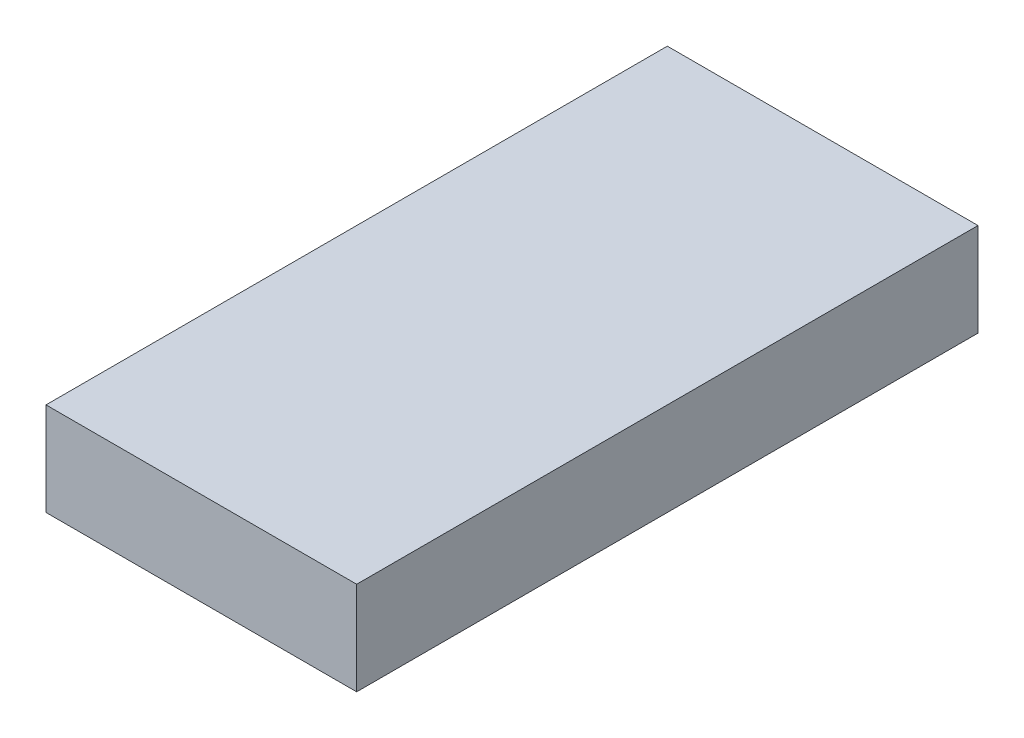
ISO-10303-21;
HEADER;
FILE_DESCRIPTION(('STEP AP214'),'2;1');
FILE_NAME('part.step','',(''),(''),'','','');
FILE_SCHEMA(('AUTOMOTIVE_DESIGN { 1 0 10303 214 1 1 1 1 }'));
ENDSEC;
DATA;
#1=APPLICATION_CONTEXT('core data for automotive mechanical design processes');
#2=APPLICATION_PROTOCOL_DEFINITION('international standard','automotive_design',2000,#1);
#3=PRODUCT_CONTEXT('',#1,'mechanical');
#4=PRODUCT('Part','Part','',(#3));
#5=PRODUCT_RELATED_PRODUCT_CATEGORY('part','',(#4));
#6=PRODUCT_DEFINITION_FORMATION('','',#4);
#7=PRODUCT_DEFINITION_CONTEXT('part definition',#1,'design');
#8=PRODUCT_DEFINITION('design','',#6,#7);
#9=PRODUCT_DEFINITION_SHAPE('','',#8);
#10=(LENGTH_UNIT() NAMED_UNIT(*) SI_UNIT(.MILLI.,.METRE.));
#11=(NAMED_UNIT(*) PLANE_ANGLE_UNIT() SI_UNIT($,.RADIAN.));
#12=(NAMED_UNIT(*) SI_UNIT($,.STERADIAN.) SOLID_ANGLE_UNIT());
#13=UNCERTAINTY_MEASURE_WITH_UNIT(LENGTH_MEASURE(1.E-05),#10,'distance_accuracy_value','');
#14=(GEOMETRIC_REPRESENTATION_CONTEXT(3) GLOBAL_UNCERTAINTY_ASSIGNED_CONTEXT((#13)) GLOBAL_UNIT_ASSIGNED_CONTEXT((#10,
#11,#12)) REPRESENTATION_CONTEXT('',''));
#15=CARTESIAN_POINT('',(0.,0.,0.));
#16=DIRECTION('',(0.,0.,1.));
#17=DIRECTION('',(1.,0.,0.));
#18=AXIS2_PLACEMENT_3D('',#15,#16,#17);
#19=CARTESIAN_POINT('',(0.,1.5,0.));
#20=DIRECTION('',(-1.,0.,0.));
#21=DIRECTION('',(0.,0.,1.));
#22=AXIS2_PLACEMENT_3D('',#19,#20,#21);
#23=PLANE('',#22);
#24=DIRECTION('',(0.,0.,-1.));
#25=VECTOR('',#24,1.);
#26=CARTESIAN_POINT('',(0.,0.,0.));
#27=LINE('',#26,#25);
#28=CARTESIAN_POINT('',(0.,0.,0.));
#29=VERTEX_POINT('',#28);
#30=CARTESIAN_POINT('',(0.,0.,-10.));
#31=VERTEX_POINT('',#30);
#32=EDGE_CURVE('E111',#29,#31,#27,.T.);
#33=ORIENTED_EDGE('',*,*,#32,.T.);
#34=DIRECTION('',(0.,-1.,0.));
#35=VECTOR('',#34,1.);
#36=CARTESIAN_POINT('',(0.,1.5,-10.));
#37=LINE('',#36,#35);
#38=CARTESIAN_POINT('',(0.,1.5,-10.));
#39=VERTEX_POINT('',#38);
#40=EDGE_CURVE('E11',#39,#31,#37,.T.);
#41=ORIENTED_EDGE('',*,*,#40,.F.);
#42=DIRECTION('',(0.,0.,-1.));
#43=VECTOR('',#42,1.);
#44=CARTESIAN_POINT('',(0.,1.5,0.));
#45=LINE('',#44,#43);
#46=CARTESIAN_POINT('',(0.,1.5,0.));
#47=VERTEX_POINT('',#46);
#48=EDGE_CURVE('E95',#47,#39,#45,.T.);
#49=ORIENTED_EDGE('',*,*,#48,.F.);
#50=DIRECTION('',(0.,-1.,0.));
#51=VECTOR('',#50,1.);
#52=CARTESIAN_POINT('',(0.,1.5,0.));
#53=LINE('',#52,#51);
#54=EDGE_CURVE('E107',#47,#29,#53,.T.);
#55=ORIENTED_EDGE('',*,*,#54,.T.);
#56=EDGE_LOOP('',(#33,#41,#49,#55));
#57=FACE_BOUND('',#56,.T.);
#58=ADVANCED_FACE('F43',(#57),#23,.F.);
#59=CARTESIAN_POINT('',(0.,1.5,-10.));
#60=DIRECTION('',(0.,0.,1.));
#61=DIRECTION('',(1.,0.,0.));
#62=AXIS2_PLACEMENT_3D('',#59,#60,#61);
#63=PLANE('',#62);
#64=DIRECTION('',(-1.,0.,0.));
#65=VECTOR('',#64,1.);
#66=CARTESIAN_POINT('',(0.,0.,-10.));
#67=LINE('',#66,#65);
#68=CARTESIAN_POINT('',(-5.,0.,-10.));
#69=VERTEX_POINT('',#68);
#70=EDGE_CURVE('E100',#31,#69,#67,.T.);
#71=ORIENTED_EDGE('',*,*,#70,.T.);
#72=DIRECTION('',(0.,-1.,0.));
#73=VECTOR('',#72,1.);
#74=CARTESIAN_POINT('',(-5.,1.5,-10.));
#75=LINE('',#74,#73);
#76=CARTESIAN_POINT('',(-5.,1.5,-10.));
#77=VERTEX_POINT('',#76);
#78=EDGE_CURVE('E52',#77,#69,#75,.T.);
#79=ORIENTED_EDGE('',*,*,#78,.F.);
#80=DIRECTION('',(-1.,0.,0.));
#81=VECTOR('',#80,1.);
#82=CARTESIAN_POINT('',(0.,1.5,-10.));
#83=LINE('',#82,#81);
#84=EDGE_CURVE('E90',#39,#77,#83,.T.);
#85=ORIENTED_EDGE('',*,*,#84,.F.);
#86=ORIENTED_EDGE('',*,*,#40,.T.);
#87=EDGE_LOOP('',(#71,#79,#85,#86));
#88=FACE_BOUND('',#87,.T.);
#89=ADVANCED_FACE('F99',(#88),#63,.F.);
#90=CARTESIAN_POINT('',(-5.,1.5,0.));
#91=DIRECTION('',(1.,0.,0.));
#92=DIRECTION('',(0.,0.,-1.));
#93=AXIS2_PLACEMENT_3D('',#90,#91,#92);
#94=PLANE('',#93);
#95=DIRECTION('',(0.,0.,1.));
#96=VECTOR('',#95,1.);
#97=CARTESIAN_POINT('',(-5.,0.,0.));
#98=LINE('',#97,#96);
#99=CARTESIAN_POINT('',(-5.,0.,0.));
#100=VERTEX_POINT('',#99);
#101=EDGE_CURVE('E77',#69,#100,#98,.T.);
#102=ORIENTED_EDGE('',*,*,#101,.T.);
#103=DIRECTION('',(0.,-1.,0.));
#104=VECTOR('',#103,1.);
#105=CARTESIAN_POINT('',(-5.,1.5,0.));
#106=LINE('',#105,#104);
#107=CARTESIAN_POINT('',(-5.,1.5,0.));
#108=VERTEX_POINT('',#107);
#109=EDGE_CURVE('E102',#108,#100,#106,.T.);
#110=ORIENTED_EDGE('',*,*,#109,.F.);
#111=DIRECTION('',(0.,0.,1.));
#112=VECTOR('',#111,1.);
#113=CARTESIAN_POINT('',(-5.,1.5,0.));
#114=LINE('',#113,#112);
#115=EDGE_CURVE('E93',#77,#108,#114,.T.);
#116=ORIENTED_EDGE('',*,*,#115,.F.);
#117=ORIENTED_EDGE('',*,*,#78,.T.);
#118=EDGE_LOOP('',(#102,#110,#116,#117));
#119=FACE_BOUND('',#118,.T.);
#120=ADVANCED_FACE('F103',(#119),#94,.F.);
#121=CARTESIAN_POINT('',(0.,1.5,0.));
#122=DIRECTION('',(0.,0.,-1.));
#123=DIRECTION('',(-1.,0.,0.));
#124=AXIS2_PLACEMENT_3D('',#121,#122,#123);
#125=PLANE('',#124);
#126=DIRECTION('',(1.,0.,0.));
#127=VECTOR('',#126,1.);
#128=CARTESIAN_POINT('',(0.,0.,0.));
#129=LINE('',#128,#127);
#130=EDGE_CURVE('E83',#100,#29,#129,.T.);
#131=ORIENTED_EDGE('',*,*,#130,.T.);
#132=ORIENTED_EDGE('',*,*,#54,.F.);
#133=DIRECTION('',(1.,0.,0.));
#134=VECTOR('',#133,1.);
#135=CARTESIAN_POINT('',(0.,1.5,0.));
#136=LINE('',#135,#134);
#137=EDGE_CURVE('E60',#108,#47,#136,.T.);
#138=ORIENTED_EDGE('',*,*,#137,.F.);
#139=ORIENTED_EDGE('',*,*,#109,.T.);
#140=EDGE_LOOP('',(#131,#132,#138,#139));
#141=FACE_BOUND('',#140,.T.);
#142=ADVANCED_FACE('F124',(#141),#125,.F.);
#143=CARTESIAN_POINT('',(0.,1.5,0.));
#144=DIRECTION('',(0.,1.,0.));
#145=DIRECTION('',(0.,0.,1.));
#146=AXIS2_PLACEMENT_3D('',#143,#144,#145);
#147=PLANE('',#146);
#148=ORIENTED_EDGE('',*,*,#48,.T.);
#149=ORIENTED_EDGE('',*,*,#84,.T.);
#150=ORIENTED_EDGE('',*,*,#115,.T.);
#151=ORIENTED_EDGE('',*,*,#137,.T.);
#152=EDGE_LOOP('',(#148,#149,#150,#151));
#153=FACE_BOUND('',#152,.T.);
#154=ADVANCED_FACE('F91',(#153),#147,.T.);
#155=CARTESIAN_POINT('',(0.,0.,0.));
#156=DIRECTION('',(0.,1.,0.));
#157=DIRECTION('',(0.,0.,1.));
#158=AXIS2_PLACEMENT_3D('',#155,#156,#157);
#159=PLANE('',#158);
#160=ORIENTED_EDGE('',*,*,#32,.F.);
#161=ORIENTED_EDGE('',*,*,#130,.F.);
#162=ORIENTED_EDGE('',*,*,#101,.F.);
#163=ORIENTED_EDGE('',*,*,#70,.F.);
#164=EDGE_LOOP('',(#160,#161,#162,#163));
#165=FACE_BOUND('',#164,.T.);
#166=ADVANCED_FACE('F127',(#165),#159,.F.);
#167=CLOSED_SHELL('',(#58,#89,#120,#142,#154,#166));
#168=MANIFOLD_SOLID_BREP('B2',#167);
#169=ADVANCED_BREP_SHAPE_REPRESENTATION('',(#18,#168),#14);
#170=SHAPE_DEFINITION_REPRESENTATION(#9,#169);
ENDSEC;
END-ISO-10303-21;
